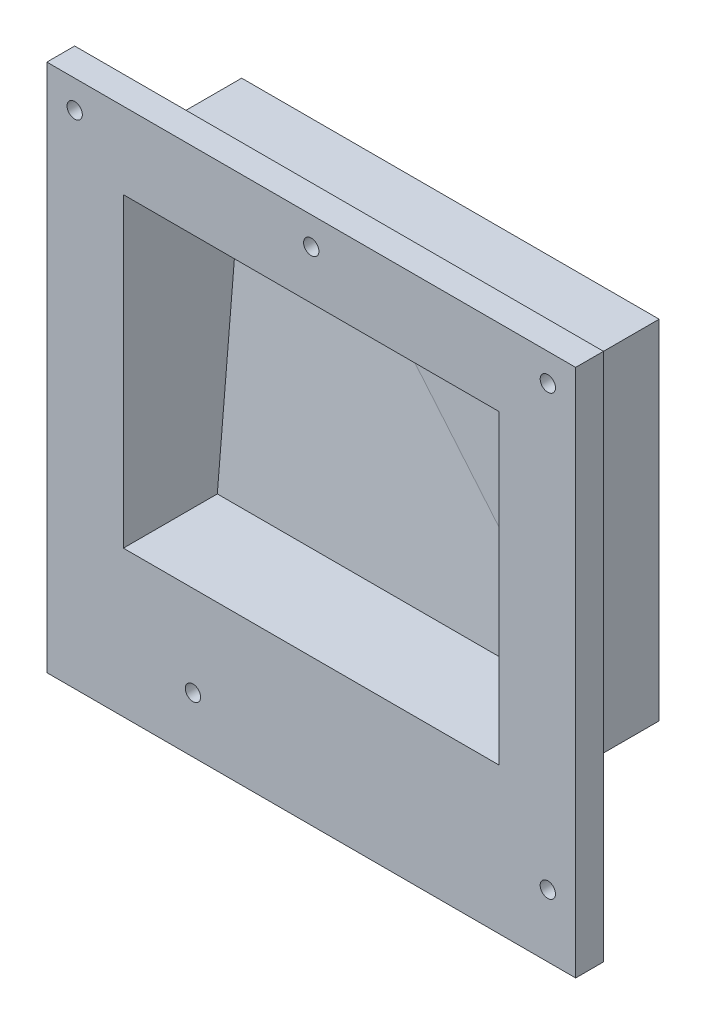
ISO-10303-21;
HEADER;
FILE_DESCRIPTION(('STEP AP214'),'2;1');
FILE_NAME('part.step','',(''),(''),'','','');
FILE_SCHEMA(('AUTOMOTIVE_DESIGN { 1 0 10303 214 1 1 1 1 }'));
ENDSEC;
DATA;
#1=APPLICATION_CONTEXT('core data for automotive mechanical design processes');
#2=APPLICATION_PROTOCOL_DEFINITION('international standard','automotive_design',2000,#1);
#3=PRODUCT_CONTEXT('',#1,'mechanical');
#4=PRODUCT('Part','Part','',(#3));
#5=PRODUCT_RELATED_PRODUCT_CATEGORY('part','',(#4));
#6=PRODUCT_DEFINITION_FORMATION('','',#4);
#7=PRODUCT_DEFINITION_CONTEXT('part definition',#1,'design');
#8=PRODUCT_DEFINITION('design','',#6,#7);
#9=PRODUCT_DEFINITION_SHAPE('','',#8);
#10=(LENGTH_UNIT() NAMED_UNIT(*) SI_UNIT(.MILLI.,.METRE.));
#11=(NAMED_UNIT(*) PLANE_ANGLE_UNIT() SI_UNIT($,.RADIAN.));
#12=(NAMED_UNIT(*) SI_UNIT($,.STERADIAN.) SOLID_ANGLE_UNIT());
#13=UNCERTAINTY_MEASURE_WITH_UNIT(LENGTH_MEASURE(1.E-05),#10,'distance_accuracy_value','');
#14=(GEOMETRIC_REPRESENTATION_CONTEXT(3) GLOBAL_UNCERTAINTY_ASSIGNED_CONTEXT((#13)) GLOBAL_UNIT_ASSIGNED_CONTEXT((#10,
#11,#12)) REPRESENTATION_CONTEXT('',''));
#15=CARTESIAN_POINT('',(0.,0.,0.));
#16=DIRECTION('',(0.,0.,1.));
#17=DIRECTION('',(1.,0.,0.));
#18=AXIS2_PLACEMENT_3D('',#15,#16,#17);
#19=CARTESIAN_POINT('',(60.,162.5,-40.));
#20=DIRECTION('',(-1.,0.,0.));
#21=DIRECTION('',(0.,0.,1.));
#22=AXIS2_PLACEMENT_3D('',#19,#20,#21);
#23=PLANE('',#22);
#24=DIRECTION('',(0.,0.,1.));
#25=VECTOR('',#24,1.);
#26=CARTESIAN_POINT('',(60.,52.5,-40.));
#27=LINE('',#26,#25);
#28=CARTESIAN_POINT('',(60.,52.5,-23.7511336474076));
#29=VERTEX_POINT('',#28);
#30=CARTESIAN_POINT('',(60.,52.5,10.));
#31=VERTEX_POINT('',#30);
#32=EDGE_CURVE('E159',#29,#31,#27,.T.);
#33=ORIENTED_EDGE('',*,*,#32,.F.);
#34=DIRECTION('',(0.,-0.996194698091745,0.0871557427476618));
#35=VECTOR('',#34,1.);
#36=CARTESIAN_POINT('',(60.,52.5,-23.7511336474076));
#37=LINE('',#36,#35);
#38=CARTESIAN_POINT('',(60.,152.499999999996,-32.5));
#39=VERTEX_POINT('',#38);
#40=EDGE_CURVE('E291',#29,#39,#37,.F.);
#41=ORIENTED_EDGE('',*,*,#40,.T.);
#42=DIRECTION('',(0.,1.,0.));
#43=VECTOR('',#42,1.);
#44=CARTESIAN_POINT('',(60.,-82.7081728298996,-32.5));
#45=LINE('',#44,#43);
#46=CARTESIAN_POINT('',(60.,162.5,-32.5));
#47=VERTEX_POINT('',#46);
#48=EDGE_CURVE('E303',#39,#47,#45,.T.);
#49=ORIENTED_EDGE('',*,*,#48,.T.);
#50=DIRECTION('',(0.,0.,1.));
#51=VECTOR('',#50,1.);
#52=CARTESIAN_POINT('',(60.,162.5,-40.));
#53=LINE('',#52,#51);
#54=CARTESIAN_POINT('',(60.,162.5,10.));
#55=VERTEX_POINT('',#54);
#56=EDGE_CURVE('E177',#47,#55,#53,.T.);
#57=ORIENTED_EDGE('',*,*,#56,.T.);
#58=DIRECTION('',(0.,-1.,0.));
#59=VECTOR('',#58,1.);
#60=CARTESIAN_POINT('',(60.,162.5,10.));
#61=LINE('',#60,#59);
#62=EDGE_CURVE('E168',#55,#31,#61,.T.);
#63=ORIENTED_EDGE('',*,*,#62,.T.);
#64=EDGE_LOOP('',(#33,#41,#49,#57,#63));
#65=FACE_BOUND('',#64,.T.);
#66=ADVANCED_FACE('F36',(#65),#23,.F.);
#67=CARTESIAN_POINT('',(60.,162.5,-40.));
#68=DIRECTION('',(0.,1.,0.));
#69=DIRECTION('',(0.,0.,1.));
#70=AXIS2_PLACEMENT_3D('',#67,#68,#69);
#71=PLANE('',#70);
#72=DIRECTION('',(-1.,0.,0.));
#73=VECTOR('',#72,1.);
#74=CARTESIAN_POINT('',(60.,162.5,-32.5));
#75=LINE('',#74,#73);
#76=CARTESIAN_POINT('',(95.0000000000039,162.5,-32.5));
#77=VERTEX_POINT('',#76);
#78=EDGE_CURVE('E297',#77,#47,#75,.T.);
#79=ORIENTED_EDGE('',*,*,#78,.F.);
#80=DIRECTION('',(-0.996194698091745,0.,-0.0871557427476618));
#81=VECTOR('',#80,1.);
#82=CARTESIAN_POINT('',(95.0000000000039,162.5,-32.5));
#83=LINE('',#82,#81);
#84=CARTESIAN_POINT('',(195.,162.5,-23.7511336474076));
#85=VERTEX_POINT('',#84);
#86=EDGE_CURVE('E46',#77,#85,#83,.F.);
#87=ORIENTED_EDGE('',*,*,#86,.T.);
#88=DIRECTION('',(0.,0.,1.));
#89=VECTOR('',#88,1.);
#90=CARTESIAN_POINT('',(195.,162.5,-40.));
#91=LINE('',#90,#89);
#92=CARTESIAN_POINT('',(195.,162.5,10.));
#93=VERTEX_POINT('',#92);
#94=EDGE_CURVE('E158',#85,#93,#91,.T.);
#95=ORIENTED_EDGE('',*,*,#94,.T.);
#96=DIRECTION('',(-1.,0.,0.));
#97=VECTOR('',#96,1.);
#98=CARTESIAN_POINT('',(60.,162.5,10.));
#99=LINE('',#98,#97);
#100=EDGE_CURVE('E172',#93,#55,#99,.T.);
#101=ORIENTED_EDGE('',*,*,#100,.T.);
#102=ORIENTED_EDGE('',*,*,#56,.F.);
#103=EDGE_LOOP('',(#79,#87,#95,#101,#102));
#104=FACE_BOUND('',#103,.T.);
#105=ADVANCED_FACE('F302',(#104),#71,.F.);
#106=CARTESIAN_POINT('',(195.,162.5,-40.));
#107=DIRECTION('',(1.,0.,0.));
#108=DIRECTION('',(0.,0.,-1.));
#109=AXIS2_PLACEMENT_3D('',#106,#107,#108);
#110=PLANE('',#109);
#111=ORIENTED_EDGE('',*,*,#94,.F.);
#112=DIRECTION('',(0.,-1.,0.));
#113=VECTOR('',#112,1.);
#114=CARTESIAN_POINT('',(195.,52.5,-23.7511336474076));
#115=LINE('',#114,#113);
#116=CARTESIAN_POINT('',(195.,52.5,-23.7511336474076));
#117=VERTEX_POINT('',#116);
#118=EDGE_CURVE('E11',#85,#117,#115,.T.);
#119=ORIENTED_EDGE('',*,*,#118,.T.);
#120=DIRECTION('',(0.,0.,1.));
#121=VECTOR('',#120,1.);
#122=CARTESIAN_POINT('',(195.,52.5,-40.));
#123=LINE('',#122,#121);
#124=CARTESIAN_POINT('',(195.,52.5,10.));
#125=VERTEX_POINT('',#124);
#126=EDGE_CURVE('E148',#117,#125,#123,.T.);
#127=ORIENTED_EDGE('',*,*,#126,.T.);
#128=DIRECTION('',(0.,1.,0.));
#129=VECTOR('',#128,1.);
#130=CARTESIAN_POINT('',(195.,162.5,10.));
#131=LINE('',#130,#129);
#132=EDGE_CURVE('E152',#125,#93,#131,.T.);
#133=ORIENTED_EDGE('',*,*,#132,.T.);
#134=EDGE_LOOP('',(#111,#119,#127,#133));
#135=FACE_BOUND('',#134,.T.);
#136=ADVANCED_FACE('F150',(#135),#110,.F.);
#137=CARTESIAN_POINT('',(60.,52.5,-40.));
#138=DIRECTION('',(0.,-1.,0.));
#139=DIRECTION('',(1.,0.,0.));
#140=AXIS2_PLACEMENT_3D('',#137,#138,#139);
#141=PLANE('',#140);
#142=ORIENTED_EDGE('',*,*,#126,.F.);
#143=DIRECTION('',(-1.,0.,0.));
#144=VECTOR('',#143,1.);
#145=CARTESIAN_POINT('',(60.,52.5,-23.7511336474076));
#146=LINE('',#145,#144);
#147=EDGE_CURVE('E289',#117,#29,#146,.T.);
#148=ORIENTED_EDGE('',*,*,#147,.T.);
#149=ORIENTED_EDGE('',*,*,#32,.T.);
#150=DIRECTION('',(1.,0.,0.));
#151=VECTOR('',#150,1.);
#152=CARTESIAN_POINT('',(60.,52.5,10.));
#153=LINE('',#152,#151);
#154=EDGE_CURVE('E162',#31,#125,#153,.T.);
#155=ORIENTED_EDGE('',*,*,#154,.T.);
#156=EDGE_LOOP('',(#142,#148,#149,#155));
#157=FACE_BOUND('',#156,.T.);
#158=ADVANCED_FACE('F163',(#157),#141,.F.);
#159=CARTESIAN_POINT('',(0.,0.,0.));
#160=DIRECTION('',(0.,0.,1.));
#161=DIRECTION('',(1.,0.,0.));
#162=AXIS2_PLACEMENT_3D('',#159,#160,#161);
#163=PLANE('',#162);
#164=CARTESIAN_POINT('',(212.5,22.5,0.));
#165=DIRECTION('',(0.,0.,1.));
#166=DIRECTION('',(1.,0.,0.));
#167=AXIS2_PLACEMENT_3D('',#164,#165,#166);
#168=CIRCLE('',#167,2.75000000000001);
#169=CARTESIAN_POINT('',(215.25,22.5,0.));
#170=VERTEX_POINT('',#169);
#171=EDGE_CURVE('E207',#170,#170,#168,.T.);
#172=ORIENTED_EDGE('',*,*,#171,.T.);
#173=EDGE_LOOP('',(#172));
#174=FACE_BOUND('',#173,.T.);
#175=CARTESIAN_POINT('',(42.5,180.,0.));
#176=DIRECTION('',(0.,0.,1.));
#177=DIRECTION('',(1.,0.,0.));
#178=AXIS2_PLACEMENT_3D('',#175,#176,#177);
#179=CIRCLE('',#178,2.75);
#180=CARTESIAN_POINT('',(45.25,180.,0.));
#181=VERTEX_POINT('',#180);
#182=EDGE_CURVE('E225',#181,#181,#179,.T.);
#183=ORIENTED_EDGE('',*,*,#182,.T.);
#184=EDGE_LOOP('',(#183));
#185=FACE_BOUND('',#184,.T.);
#186=CARTESIAN_POINT('',(127.5,180.,0.));
#187=DIRECTION('',(0.,0.,1.));
#188=DIRECTION('',(1.,0.,0.));
#189=AXIS2_PLACEMENT_3D('',#186,#187,#188);
#190=CIRCLE('',#189,2.75000000000001);
#191=CARTESIAN_POINT('',(130.25,180.,0.));
#192=VERTEX_POINT('',#191);
#193=EDGE_CURVE('E222',#192,#192,#190,.T.);
#194=ORIENTED_EDGE('',*,*,#193,.T.);
#195=EDGE_LOOP('',(#194));
#196=FACE_BOUND('',#195,.T.);
#197=CARTESIAN_POINT('',(212.5,180.,0.));
#198=DIRECTION('',(0.,0.,1.));
#199=DIRECTION('',(1.,0.,0.));
#200=AXIS2_PLACEMENT_3D('',#197,#198,#199);
#201=CIRCLE('',#200,2.75000000000001);
#202=CARTESIAN_POINT('',(215.25,180.,0.));
#203=VERTEX_POINT('',#202);
#204=EDGE_CURVE('E214',#203,#203,#201,.T.);
#205=ORIENTED_EDGE('',*,*,#204,.T.);
#206=EDGE_LOOP('',(#205));
#207=FACE_BOUND('',#206,.T.);
#208=DIRECTION('',(0.,1.,0.));
#209=VECTOR('',#208,1.);
#210=CARTESIAN_POINT('',(52.5,0.,0.));
#211=LINE('',#210,#209);
#212=CARTESIAN_POINT('',(52.5,0.,0.));
#213=VERTEX_POINT('',#212);
#214=CARTESIAN_POINT('',(52.5,170.,0.));
#215=VERTEX_POINT('',#214);
#216=EDGE_CURVE('E278',#213,#215,#211,.T.);
#217=ORIENTED_EDGE('',*,*,#216,.F.);
#218=DIRECTION('',(1.,0.,0.));
#219=VECTOR('',#218,1.);
#220=CARTESIAN_POINT('',(0.,0.,0.));
#221=LINE('',#220,#219);
#222=CARTESIAN_POINT('',(32.5,0.,0.));
#223=VERTEX_POINT('',#222);
#224=EDGE_CURVE('E267',#223,#213,#221,.T.);
#225=ORIENTED_EDGE('',*,*,#224,.F.);
#226=DIRECTION('',(0.,1.,0.));
#227=VECTOR('',#226,1.);
#228=CARTESIAN_POINT('',(32.5,0.,0.));
#229=LINE('',#228,#227);
#230=CARTESIAN_POINT('',(32.5,190.,0.));
#231=VERTEX_POINT('',#230);
#232=EDGE_CURVE('E250',#223,#231,#229,.T.);
#233=ORIENTED_EDGE('',*,*,#232,.T.);
#234=DIRECTION('',(1.,0.,0.));
#235=VECTOR('',#234,1.);
#236=CARTESIAN_POINT('',(0.,190.,0.));
#237=LINE('',#236,#235);
#238=CARTESIAN_POINT('',(222.5,190.,0.));
#239=VERTEX_POINT('',#238);
#240=EDGE_CURVE('E273',#231,#239,#237,.T.);
#241=ORIENTED_EDGE('',*,*,#240,.T.);
#242=DIRECTION('',(0.,-1.,0.));
#243=VECTOR('',#242,1.);
#244=CARTESIAN_POINT('',(222.5,0.,0.));
#245=LINE('',#244,#243);
#246=CARTESIAN_POINT('',(222.5,0.,0.));
#247=VERTEX_POINT('',#246);
#248=EDGE_CURVE('E270',#239,#247,#245,.T.);
#249=ORIENTED_EDGE('',*,*,#248,.T.);
#250=CARTESIAN_POINT('',(202.5,0.,0.));
#251=VERTEX_POINT('',#250);
#252=EDGE_CURVE('E266',#251,#247,#221,.T.);
#253=ORIENTED_EDGE('',*,*,#252,.F.);
#254=DIRECTION('',(0.,-1.,0.));
#255=VECTOR('',#254,1.);
#256=CARTESIAN_POINT('',(202.5,0.,0.));
#257=LINE('',#256,#255);
#258=CARTESIAN_POINT('',(202.5,170.,0.));
#259=VERTEX_POINT('',#258);
#260=EDGE_CURVE('E276',#259,#251,#257,.T.);
#261=ORIENTED_EDGE('',*,*,#260,.F.);
#262=DIRECTION('',(1.,0.,0.));
#263=VECTOR('',#262,1.);
#264=CARTESIAN_POINT('',(0.,170.,0.));
#265=LINE('',#264,#263);
#266=EDGE_CURVE('E255',#215,#259,#265,.T.);
#267=ORIENTED_EDGE('',*,*,#266,.F.);
#268=EDGE_LOOP('',(#217,#225,#233,#241,#249,#253,#261,#267));
#269=FACE_BOUND('',#268,.T.);
#270=ADVANCED_FACE('F367',(#174,#185,#196,#207,#269),#163,.F.);
#271=CARTESIAN_POINT('',(32.5,0.,10.));
#272=DIRECTION('',(-1.,0.,0.));
#273=DIRECTION('',(0.,-1.,0.));
#274=AXIS2_PLACEMENT_3D('',#271,#272,#273);
#275=PLANE('',#274);
#276=ORIENTED_EDGE('',*,*,#232,.F.);
#277=DIRECTION('',(0.,0.,-1.));
#278=VECTOR('',#277,1.);
#279=CARTESIAN_POINT('',(32.5,0.,10.));
#280=LINE('',#279,#278);
#281=CARTESIAN_POINT('',(32.5,0.,10.));
#282=VERTEX_POINT('',#281);
#283=EDGE_CURVE('E287',#282,#223,#280,.T.);
#284=ORIENTED_EDGE('',*,*,#283,.F.);
#285=DIRECTION('',(0.,1.,0.));
#286=VECTOR('',#285,1.);
#287=CARTESIAN_POINT('',(32.5,0.,10.));
#288=LINE('',#287,#286);
#289=CARTESIAN_POINT('',(32.5,190.,10.));
#290=VERTEX_POINT('',#289);
#291=EDGE_CURVE('E251',#282,#290,#288,.T.);
#292=ORIENTED_EDGE('',*,*,#291,.T.);
#293=DIRECTION('',(0.,0.,-1.));
#294=VECTOR('',#293,1.);
#295=CARTESIAN_POINT('',(32.5,190.,10.));
#296=LINE('',#295,#294);
#297=EDGE_CURVE('E263',#290,#231,#296,.T.);
#298=ORIENTED_EDGE('',*,*,#297,.T.);
#299=EDGE_LOOP('',(#276,#284,#292,#298));
#300=FACE_BOUND('',#299,.T.);
#301=ADVANCED_FACE('F370',(#300),#275,.T.);
#302=CARTESIAN_POINT('',(0.,0.,10.));
#303=DIRECTION('',(0.,1.,0.));
#304=DIRECTION('',(0.,0.,1.));
#305=AXIS2_PLACEMENT_3D('',#302,#303,#304);
#306=PLANE('',#305);
#307=ORIENTED_EDGE('',*,*,#224,.T.);
#308=DIRECTION('',(0.,0.,1.));
#309=VECTOR('',#308,1.);
#310=CARTESIAN_POINT('',(52.5,0.,-10.));
#311=LINE('',#310,#309);
#312=CARTESIAN_POINT('',(52.5,0.,-10.));
#313=VERTEX_POINT('',#312);
#314=EDGE_CURVE('E244',#313,#213,#311,.T.);
#315=ORIENTED_EDGE('',*,*,#314,.F.);
#316=DIRECTION('',(-1.,0.,0.));
#317=VECTOR('',#316,1.);
#318=CARTESIAN_POINT('',(52.5,0.,-10.));
#319=LINE('',#318,#317);
#320=CARTESIAN_POINT('',(202.5,0.,-10.));
#321=VERTEX_POINT('',#320);
#322=EDGE_CURVE('E242',#321,#313,#319,.T.);
#323=ORIENTED_EDGE('',*,*,#322,.F.);
#324=DIRECTION('',(0.,0.,1.));
#325=VECTOR('',#324,1.);
#326=CARTESIAN_POINT('',(202.5,0.,-10.));
#327=LINE('',#326,#325);
#328=EDGE_CURVE('E247',#321,#251,#327,.T.);
#329=ORIENTED_EDGE('',*,*,#328,.T.);
#330=ORIENTED_EDGE('',*,*,#252,.T.);
#331=DIRECTION('',(0.,0.,-1.));
#332=VECTOR('',#331,1.);
#333=CARTESIAN_POINT('',(222.5,0.,10.));
#334=LINE('',#333,#332);
#335=CARTESIAN_POINT('',(222.5,0.,10.));
#336=VERTEX_POINT('',#335);
#337=EDGE_CURVE('E284',#336,#247,#334,.T.);
#338=ORIENTED_EDGE('',*,*,#337,.F.);
#339=DIRECTION('',(1.,0.,0.));
#340=VECTOR('',#339,1.);
#341=CARTESIAN_POINT('',(0.,0.,10.));
#342=LINE('',#341,#340);
#343=EDGE_CURVE('E254',#282,#336,#342,.T.);
#344=ORIENTED_EDGE('',*,*,#343,.F.);
#345=ORIENTED_EDGE('',*,*,#283,.T.);
#346=EDGE_LOOP('',(#307,#315,#323,#329,#330,#338,#344,#345));
#347=FACE_BOUND('',#346,.T.);
#348=ADVANCED_FACE('F378',(#347),#306,.F.);
#349=CARTESIAN_POINT('',(222.5,0.,10.));
#350=DIRECTION('',(1.,0.,0.));
#351=DIRECTION('',(0.,0.,-1.));
#352=AXIS2_PLACEMENT_3D('',#349,#350,#351);
#353=PLANE('',#352);
#354=ORIENTED_EDGE('',*,*,#248,.F.);
#355=DIRECTION('',(0.,0.,-1.));
#356=VECTOR('',#355,1.);
#357=CARTESIAN_POINT('',(222.5,190.,10.));
#358=LINE('',#357,#356);
#359=CARTESIAN_POINT('',(222.5,190.,10.));
#360=VERTEX_POINT('',#359);
#361=EDGE_CURVE('E282',#360,#239,#358,.T.);
#362=ORIENTED_EDGE('',*,*,#361,.F.);
#363=DIRECTION('',(0.,-1.,0.));
#364=VECTOR('',#363,1.);
#365=CARTESIAN_POINT('',(222.5,0.,10.));
#366=LINE('',#365,#364);
#367=EDGE_CURVE('E257',#360,#336,#366,.T.);
#368=ORIENTED_EDGE('',*,*,#367,.T.);
#369=ORIENTED_EDGE('',*,*,#337,.T.);
#370=EDGE_LOOP('',(#354,#362,#368,#369));
#371=FACE_BOUND('',#370,.T.);
#372=ADVANCED_FACE('F374',(#371),#353,.T.);
#373=CARTESIAN_POINT('',(0.,190.,10.));
#374=DIRECTION('',(0.,1.,0.));
#375=DIRECTION('',(0.,0.,1.));
#376=AXIS2_PLACEMENT_3D('',#373,#374,#375);
#377=PLANE('',#376);
#378=ORIENTED_EDGE('',*,*,#240,.F.);
#379=ORIENTED_EDGE('',*,*,#297,.F.);
#380=DIRECTION('',(1.,0.,0.));
#381=VECTOR('',#380,1.);
#382=CARTESIAN_POINT('',(0.,190.,10.));
#383=LINE('',#382,#381);
#384=EDGE_CURVE('E260',#290,#360,#383,.T.);
#385=ORIENTED_EDGE('',*,*,#384,.T.);
#386=ORIENTED_EDGE('',*,*,#361,.T.);
#387=EDGE_LOOP('',(#378,#379,#385,#386));
#388=FACE_BOUND('',#387,.T.);
#389=ADVANCED_FACE('F365',(#388),#377,.T.);
#390=CARTESIAN_POINT('',(0.,0.,10.));
#391=DIRECTION('',(0.,0.,1.));
#392=DIRECTION('',(1.,0.,0.));
#393=AXIS2_PLACEMENT_3D('',#390,#391,#392);
#394=PLANE('',#393);
#395=CARTESIAN_POINT('',(212.5,22.5,10.));
#396=DIRECTION('',(0.,0.,1.));
#397=DIRECTION('',(1.,0.,0.));
#398=AXIS2_PLACEMENT_3D('',#395,#396,#397);
#399=CIRCLE('',#398,2.75000000000001);
#400=CARTESIAN_POINT('',(215.25,22.5,10.));
#401=VERTEX_POINT('',#400);
#402=EDGE_CURVE('E197',#401,#401,#399,.T.);
#403=ORIENTED_EDGE('',*,*,#402,.F.);
#404=EDGE_LOOP('',(#403));
#405=FACE_BOUND('',#404,.T.);
#406=CARTESIAN_POINT('',(42.5,180.,10.));
#407=DIRECTION('',(0.,0.,1.));
#408=DIRECTION('',(1.,0.,0.));
#409=AXIS2_PLACEMENT_3D('',#406,#407,#408);
#410=CIRCLE('',#409,2.75);
#411=CARTESIAN_POINT('',(45.25,180.,10.));
#412=VERTEX_POINT('',#411);
#413=EDGE_CURVE('E211',#412,#412,#410,.T.);
#414=ORIENTED_EDGE('',*,*,#413,.F.);
#415=EDGE_LOOP('',(#414));
#416=FACE_BOUND('',#415,.T.);
#417=CARTESIAN_POINT('',(127.5,180.,10.));
#418=DIRECTION('',(0.,0.,1.));
#419=DIRECTION('',(1.,0.,0.));
#420=AXIS2_PLACEMENT_3D('',#417,#418,#419);
#421=CIRCLE('',#420,2.75000000000001);
#422=CARTESIAN_POINT('',(130.25,180.,10.));
#423=VERTEX_POINT('',#422);
#424=EDGE_CURVE('E215',#423,#423,#421,.T.);
#425=ORIENTED_EDGE('',*,*,#424,.F.);
#426=EDGE_LOOP('',(#425));
#427=FACE_BOUND('',#426,.T.);
#428=CARTESIAN_POINT('',(212.5,180.,10.));
#429=DIRECTION('',(0.,0.,1.));
#430=DIRECTION('',(1.,0.,0.));
#431=AXIS2_PLACEMENT_3D('',#428,#429,#430);
#432=CIRCLE('',#431,2.75000000000001);
#433=CARTESIAN_POINT('',(215.25,180.,10.));
#434=VERTEX_POINT('',#433);
#435=EDGE_CURVE('E210',#434,#434,#432,.T.);
#436=ORIENTED_EDGE('',*,*,#435,.F.);
#437=EDGE_LOOP('',(#436));
#438=FACE_BOUND('',#437,.T.);
#439=CARTESIAN_POINT('',(85.,20.,10.));
#440=DIRECTION('',(0.,0.,1.));
#441=DIRECTION('',(1.,0.,0.));
#442=AXIS2_PLACEMENT_3D('',#439,#440,#441);
#443=CIRCLE('',#442,2.75000000000001);
#444=CARTESIAN_POINT('',(87.75,20.,10.));
#445=VERTEX_POINT('',#444);
#446=EDGE_CURVE('E231',#445,#445,#443,.T.);
#447=ORIENTED_EDGE('',*,*,#446,.F.);
#448=EDGE_LOOP('',(#447));
#449=FACE_BOUND('',#448,.T.);
#450=ORIENTED_EDGE('',*,*,#291,.F.);
#451=ORIENTED_EDGE('',*,*,#343,.T.);
#452=ORIENTED_EDGE('',*,*,#367,.F.);
#453=ORIENTED_EDGE('',*,*,#384,.F.);
#454=EDGE_LOOP('',(#450,#451,#452,#453));
#455=FACE_BOUND('',#454,.T.);
#456=ORIENTED_EDGE('',*,*,#62,.F.);
#457=ORIENTED_EDGE('',*,*,#100,.F.);
#458=ORIENTED_EDGE('',*,*,#132,.F.);
#459=ORIENTED_EDGE('',*,*,#154,.F.);
#460=EDGE_LOOP('',(#456,#457,#458,#459));
#461=FACE_BOUND('',#460,.T.);
#462=ADVANCED_FACE('F170',(#405,#416,#427,#438,#449,#455,#461),#394,.T.);
#463=CARTESIAN_POINT('',(52.5,45.,-10.));
#464=DIRECTION('',(1.,0.,0.));
#465=DIRECTION('',(0.,0.,-1.));
#466=AXIS2_PLACEMENT_3D('',#463,#464,#465);
#467=PLANE('',#466);
#468=ORIENTED_EDGE('',*,*,#314,.T.);
#469=ORIENTED_EDGE('',*,*,#216,.T.);
#470=DIRECTION('',(0.,0.,1.));
#471=VECTOR('',#470,1.);
#472=CARTESIAN_POINT('',(52.5,170.,-40.));
#473=LINE('',#472,#471);
#474=CARTESIAN_POINT('',(52.5,170.,-40.));
#475=VERTEX_POINT('',#474);
#476=EDGE_CURVE('E194',#475,#215,#473,.T.);
#477=ORIENTED_EDGE('',*,*,#476,.F.);
#478=DIRECTION('',(0.,-1.,0.));
#479=VECTOR('',#478,1.);
#480=CARTESIAN_POINT('',(52.5,170.,-40.));
#481=LINE('',#480,#479);
#482=CARTESIAN_POINT('',(52.5,45.,-40.));
#483=VERTEX_POINT('',#482);
#484=EDGE_CURVE('E179',#475,#483,#481,.T.);
#485=ORIENTED_EDGE('',*,*,#484,.T.);
#486=DIRECTION('',(0.,0.,1.));
#487=VECTOR('',#486,1.);
#488=CARTESIAN_POINT('',(52.5,45.,-40.));
#489=LINE('',#488,#487);
#490=CARTESIAN_POINT('',(52.5,45.,-10.));
#491=VERTEX_POINT('',#490);
#492=EDGE_CURVE('E193',#483,#491,#489,.T.);
#493=ORIENTED_EDGE('',*,*,#492,.T.);
#494=DIRECTION('',(0.,1.,0.));
#495=VECTOR('',#494,1.);
#496=CARTESIAN_POINT('',(52.5,45.,-10.));
#497=LINE('',#496,#495);
#498=EDGE_CURVE('E234',#313,#491,#497,.T.);
#499=ORIENTED_EDGE('',*,*,#498,.F.);
#500=EDGE_LOOP('',(#468,#469,#477,#485,#493,#499));
#501=FACE_BOUND('',#500,.T.);
#502=ADVANCED_FACE('F358',(#501),#467,.F.);
#503=CARTESIAN_POINT('',(202.5,45.,-10.));
#504=DIRECTION('',(-1.,0.,0.));
#505=DIRECTION('',(0.,0.,1.));
#506=AXIS2_PLACEMENT_3D('',#503,#504,#505);
#507=PLANE('',#506);
#508=ORIENTED_EDGE('',*,*,#260,.T.);
#509=ORIENTED_EDGE('',*,*,#328,.F.);
#510=DIRECTION('',(0.,-1.,0.));
#511=VECTOR('',#510,1.);
#512=CARTESIAN_POINT('',(202.5,45.,-10.));
#513=LINE('',#512,#511);
#514=CARTESIAN_POINT('',(202.5,45.,-10.));
#515=VERTEX_POINT('',#514);
#516=EDGE_CURVE('E240',#515,#321,#513,.T.);
#517=ORIENTED_EDGE('',*,*,#516,.F.);
#518=DIRECTION('',(0.,0.,1.));
#519=VECTOR('',#518,1.);
#520=CARTESIAN_POINT('',(202.5,45.,-40.));
#521=LINE('',#520,#519);
#522=CARTESIAN_POINT('',(202.5,45.,-40.));
#523=VERTEX_POINT('',#522);
#524=EDGE_CURVE('E201',#523,#515,#521,.T.);
#525=ORIENTED_EDGE('',*,*,#524,.F.);
#526=DIRECTION('',(0.,1.,0.));
#527=VECTOR('',#526,1.);
#528=CARTESIAN_POINT('',(202.5,170.,-40.));
#529=LINE('',#528,#527);
#530=CARTESIAN_POINT('',(202.5,170.,-40.));
#531=VERTEX_POINT('',#530);
#532=EDGE_CURVE('E187',#523,#531,#529,.T.);
#533=ORIENTED_EDGE('',*,*,#532,.T.);
#534=DIRECTION('',(0.,0.,1.));
#535=VECTOR('',#534,1.);
#536=CARTESIAN_POINT('',(202.5,170.,-40.));
#537=LINE('',#536,#535);
#538=EDGE_CURVE('E198',#531,#259,#537,.T.);
#539=ORIENTED_EDGE('',*,*,#538,.T.);
#540=EDGE_LOOP('',(#508,#509,#517,#525,#533,#539));
#541=FACE_BOUND('',#540,.T.);
#542=ADVANCED_FACE('F354',(#541),#507,.F.);
#543=CARTESIAN_POINT('',(0.,0.,-10.));
#544=DIRECTION('',(0.,0.,1.));
#545=DIRECTION('',(1.,0.,0.));
#546=AXIS2_PLACEMENT_3D('',#543,#544,#545);
#547=PLANE('',#546);
#548=CARTESIAN_POINT('',(85.,20.,-10.));
#549=DIRECTION('',(0.,0.,-1.));
#550=DIRECTION('',(-1.,0.,0.));
#551=AXIS2_PLACEMENT_3D('',#548,#549,#550);
#552=CIRCLE('',#551,2.75000000000001);
#553=CARTESIAN_POINT('',(82.25,20.,-10.));
#554=VERTEX_POINT('',#553);
#555=EDGE_CURVE('E228',#554,#554,#552,.T.);
#556=ORIENTED_EDGE('',*,*,#555,.F.);
#557=EDGE_LOOP('',(#556));
#558=FACE_BOUND('',#557,.T.);
#559=ORIENTED_EDGE('',*,*,#498,.T.);
#560=DIRECTION('',(1.,0.,0.));
#561=VECTOR('',#560,1.);
#562=CARTESIAN_POINT('',(52.5,45.,-10.));
#563=LINE('',#562,#561);
#564=EDGE_CURVE('E237',#491,#515,#563,.T.);
#565=ORIENTED_EDGE('',*,*,#564,.T.);
#566=ORIENTED_EDGE('',*,*,#516,.T.);
#567=ORIENTED_EDGE('',*,*,#322,.T.);
#568=EDGE_LOOP('',(#559,#565,#566,#567));
#569=FACE_BOUND('',#568,.T.);
#570=ADVANCED_FACE('F350',(#558,#569),#547,.F.);
#571=CARTESIAN_POINT('',(85.,20.,20.));
#572=DIRECTION('',(0.,0.,-1.));
#573=DIRECTION('',(-1.,0.,0.));
#574=AXIS2_PLACEMENT_3D('',#571,#572,#573);
#575=CYLINDRICAL_SURFACE('',#574,2.75000000000001);
#576=ORIENTED_EDGE('',*,*,#446,.T.);
#577=EDGE_LOOP('',(#576));
#578=FACE_BOUND('',#577,.T.);
#579=ORIENTED_EDGE('',*,*,#555,.T.);
#580=EDGE_LOOP('',(#579));
#581=FACE_BOUND('',#580,.T.);
#582=ADVANCED_FACE('F346',(#578,#581),#575,.F.);
#583=CARTESIAN_POINT('',(212.5,180.,-20.));
#584=DIRECTION('',(0.,0.,1.));
#585=DIRECTION('',(1.,0.,0.));
#586=AXIS2_PLACEMENT_3D('',#583,#584,#585);
#587=CYLINDRICAL_SURFACE('',#586,2.75000000000001);
#588=ORIENTED_EDGE('',*,*,#435,.T.);
#589=EDGE_LOOP('',(#588));
#590=FACE_BOUND('',#589,.T.);
#591=ORIENTED_EDGE('',*,*,#204,.F.);
#592=EDGE_LOOP('',(#591));
#593=FACE_BOUND('',#592,.T.);
#594=ADVANCED_FACE('F342',(#590,#593),#587,.F.);
#595=CARTESIAN_POINT('',(127.5,180.,-20.));
#596=DIRECTION('',(0.,0.,1.));
#597=DIRECTION('',(1.,0.,0.));
#598=AXIS2_PLACEMENT_3D('',#595,#596,#597);
#599=CYLINDRICAL_SURFACE('',#598,2.75000000000001);
#600=ORIENTED_EDGE('',*,*,#424,.T.);
#601=EDGE_LOOP('',(#600));
#602=FACE_BOUND('',#601,.T.);
#603=ORIENTED_EDGE('',*,*,#193,.F.);
#604=EDGE_LOOP('',(#603));
#605=FACE_BOUND('',#604,.T.);
#606=ADVANCED_FACE('F338',(#602,#605),#599,.F.);
#607=CARTESIAN_POINT('',(42.5,180.,-20.));
#608=DIRECTION('',(0.,0.,1.));
#609=DIRECTION('',(1.,0.,0.));
#610=AXIS2_PLACEMENT_3D('',#607,#608,#609);
#611=CYLINDRICAL_SURFACE('',#610,2.75);
#612=ORIENTED_EDGE('',*,*,#413,.T.);
#613=EDGE_LOOP('',(#612));
#614=FACE_BOUND('',#613,.T.);
#615=ORIENTED_EDGE('',*,*,#182,.F.);
#616=EDGE_LOOP('',(#615));
#617=FACE_BOUND('',#616,.T.);
#618=ADVANCED_FACE('F334',(#614,#617),#611,.F.);
#619=CARTESIAN_POINT('',(212.5,22.5,-37.));
#620=DIRECTION('',(0.,0.,1.));
#621=DIRECTION('',(1.,0.,0.));
#622=AXIS2_PLACEMENT_3D('',#619,#620,#621);
#623=CYLINDRICAL_SURFACE('',#622,2.75000000000001);
#624=CARTESIAN_POINT('',(215.25,22.5,10.));
#625=CARTESIAN_POINT('',(215.25,22.5,9.89583333333333));
#626=CARTESIAN_POINT('',(215.25,22.5,9.79166666666667));
#627=CARTESIAN_POINT('',(215.25,22.5,9.58333333333333));
#628=CARTESIAN_POINT('',(215.25,22.5,9.47916666666667));
#629=CARTESIAN_POINT('',(215.25,22.5,9.27083333333333));
#630=CARTESIAN_POINT('',(215.25,22.5,9.16666666666667));
#631=CARTESIAN_POINT('',(215.25,22.5,8.95833333333333));
#632=CARTESIAN_POINT('',(215.25,22.5,8.85416666666667));
#633=CARTESIAN_POINT('',(215.25,22.5,8.64583333333333));
#634=CARTESIAN_POINT('',(215.25,22.5,8.54166666666667));
#635=CARTESIAN_POINT('',(215.25,22.5,8.33333333333333));
#636=CARTESIAN_POINT('',(215.25,22.5,8.22916666666667));
#637=CARTESIAN_POINT('',(215.25,22.5,8.02083333333333));
#638=CARTESIAN_POINT('',(215.25,22.5,7.91666666666667));
#639=CARTESIAN_POINT('',(215.25,22.5,7.70833333333333));
#640=CARTESIAN_POINT('',(215.25,22.5,7.60416666666667));
#641=CARTESIAN_POINT('',(215.25,22.5,7.39583333333333));
#642=CARTESIAN_POINT('',(215.25,22.5,7.29166666666667));
#643=CARTESIAN_POINT('',(215.25,22.5,7.08333333333333));
#644=CARTESIAN_POINT('',(215.25,22.5,6.97916666666667));
#645=CARTESIAN_POINT('',(215.25,22.5,6.77083333333333));
#646=CARTESIAN_POINT('',(215.25,22.5,6.66666666666667));
#647=CARTESIAN_POINT('',(215.25,22.5,6.45833333333333));
#648=CARTESIAN_POINT('',(215.25,22.5,6.35416666666667));
#649=CARTESIAN_POINT('',(215.25,22.5,6.14583333333333));
#650=CARTESIAN_POINT('',(215.25,22.5,6.04166666666667));
#651=CARTESIAN_POINT('',(215.25,22.5,5.83333333333333));
#652=CARTESIAN_POINT('',(215.25,22.5,5.72916666666666));
#653=CARTESIAN_POINT('',(215.25,22.5,5.52083333333333));
#654=CARTESIAN_POINT('',(215.25,22.5,5.41666666666666));
#655=CARTESIAN_POINT('',(215.25,22.5,5.20833333333333));
#656=CARTESIAN_POINT('',(215.25,22.5,5.10416666666666));
#657=CARTESIAN_POINT('',(215.25,22.5,4.89583333333333));
#658=CARTESIAN_POINT('',(215.25,22.5,4.79166666666666));
#659=CARTESIAN_POINT('',(215.25,22.5,4.58333333333333));
#660=CARTESIAN_POINT('',(215.25,22.5,4.47916666666666));
#661=CARTESIAN_POINT('',(215.25,22.5,4.27083333333333));
#662=CARTESIAN_POINT('',(215.25,22.5,4.16666666666666));
#663=CARTESIAN_POINT('',(215.25,22.5,3.95833333333333));
#664=CARTESIAN_POINT('',(215.25,22.5,3.85416666666666));
#665=CARTESIAN_POINT('',(215.25,22.5,3.64583333333333));
#666=CARTESIAN_POINT('',(215.25,22.5,3.54166666666666));
#667=CARTESIAN_POINT('',(215.25,22.5,3.33333333333333));
#668=CARTESIAN_POINT('',(215.25,22.5,3.22916666666666));
#669=CARTESIAN_POINT('',(215.25,22.5,3.02083333333333));
#670=CARTESIAN_POINT('',(215.25,22.5,2.91666666666666));
#671=CARTESIAN_POINT('',(215.25,22.5,2.70833333333333));
#672=CARTESIAN_POINT('',(215.25,22.5,2.60416666666666));
#673=CARTESIAN_POINT('',(215.25,22.5,2.39583333333333));
#674=CARTESIAN_POINT('',(215.25,22.5,2.29166666666666));
#675=CARTESIAN_POINT('',(215.25,22.5,2.08333333333333));
#676=CARTESIAN_POINT('',(215.25,22.5,1.97916666666666));
#677=CARTESIAN_POINT('',(215.25,22.5,1.77083333333333));
#678=CARTESIAN_POINT('',(215.25,22.5,1.66666666666666));
#679=CARTESIAN_POINT('',(215.25,22.5,1.45833333333333));
#680=CARTESIAN_POINT('',(215.25,22.5,1.35416666666666));
#681=CARTESIAN_POINT('',(215.25,22.5,1.14583333333333));
#682=CARTESIAN_POINT('',(215.25,22.5,1.04166666666666));
#683=CARTESIAN_POINT('',(215.25,22.5,0.833333333333327));
#684=CARTESIAN_POINT('',(215.25,22.5,0.72916666666666));
#685=CARTESIAN_POINT('',(215.25,22.5,0.520833333333327));
#686=CARTESIAN_POINT('',(215.25,22.5,0.41666666666666));
#687=CARTESIAN_POINT('',(215.25,22.5,0.208333333333327));
#688=CARTESIAN_POINT('',(215.25,22.5,0.10416666666666));
#689=CARTESIAN_POINT('',(215.25,22.5,0.));
#690=B_SPLINE_CURVE_WITH_KNOTS('',3,(#624,#625,#626,#627,#628,#629,#630,#631,#632,#633,#634,
#635,#636,#637,#638,#639,#640,#641,#642,#643,#644,#645,#646,#647,#648,#649,#650,#651,#652,#653,
#654,#655,#656,#657,#658,#659,#660,#661,#662,#663,#664,#665,#666,#667,#668,#669,#670,#671,#672,
#673,#674,#675,#676,#677,#678,#679,#680,#681,#682,#683,#684,#685,#686,#687,#688,#689),
.UNSPECIFIED.,.F.,.F.,(4,2,2,2,2,2,2,2,2,2,2,2,2,2,2,2,2,2,2,2,2,2,2,2,2,2,2,2,2,2,2,2,4),(0.,
0.3125,0.625000000000001,0.937500000000001,1.25,1.5625,1.875,2.1875,2.5,2.8125,3.125,3.4375,
3.75,4.0625,4.375,4.6875,5.,5.3125,5.62500000000001,5.93750000000001,6.25000000000001,
6.56250000000001,6.87500000000001,7.18750000000001,7.50000000000001,7.81250000000001,
8.12500000000001,8.43750000000001,8.75000000000001,9.06250000000001,9.37500000000001,
9.68750000000001,10.),.UNSPECIFIED.);
#691=EDGE_CURVE('BSEAM327',#401,#170,#690,.T.);
#692=ORIENTED_EDGE('',*,*,#402,.T.);
#693=ORIENTED_EDGE('',*,*,#171,.F.);
#694=ORIENTED_EDGE('',*,*,#691,.T.);
#695=ORIENTED_EDGE('',*,*,#691,.F.);
#696=EDGE_LOOP('',(#692,#694,#693,#695));
#697=FACE_BOUND('',#696,.T.);
#698=ADVANCED_FACE('F327',(#697),#623,.F.);
#699=CARTESIAN_POINT('',(52.5,170.,-40.));
#700=DIRECTION('',(0.,1.,0.));
#701=DIRECTION('',(0.,0.,1.));
#702=AXIS2_PLACEMENT_3D('',#699,#700,#701);
#703=PLANE('',#702);
#704=ORIENTED_EDGE('',*,*,#266,.T.);
#705=ORIENTED_EDGE('',*,*,#538,.F.);
#706=DIRECTION('',(-1.,0.,0.));
#707=VECTOR('',#706,1.);
#708=CARTESIAN_POINT('',(52.5,170.,-40.));
#709=LINE('',#708,#707);
#710=EDGE_CURVE('E190',#531,#475,#709,.T.);
#711=ORIENTED_EDGE('',*,*,#710,.T.);
#712=ORIENTED_EDGE('',*,*,#476,.T.);
#713=EDGE_LOOP('',(#704,#705,#711,#712));
#714=FACE_BOUND('',#713,.T.);
#715=ADVANCED_FACE('F324',(#714),#703,.T.);
#716=CARTESIAN_POINT('',(52.5,45.,-40.));
#717=DIRECTION('',(0.,-1.,0.));
#718=DIRECTION('',(0.,0.,-1.));
#719=AXIS2_PLACEMENT_3D('',#716,#717,#718);
#720=PLANE('',#719);
#721=ORIENTED_EDGE('',*,*,#564,.F.);
#722=ORIENTED_EDGE('',*,*,#492,.F.);
#723=DIRECTION('',(1.,0.,0.));
#724=VECTOR('',#723,1.);
#725=CARTESIAN_POINT('',(52.5,45.,-40.));
#726=LINE('',#725,#724);
#727=EDGE_CURVE('E184',#483,#523,#726,.T.);
#728=ORIENTED_EDGE('',*,*,#727,.T.);
#729=ORIENTED_EDGE('',*,*,#524,.T.);
#730=EDGE_LOOP('',(#721,#722,#728,#729));
#731=FACE_BOUND('',#730,.T.);
#732=ADVANCED_FACE('F322',(#731),#720,.T.);
#733=CARTESIAN_POINT('',(0.,0.,-40.));
#734=DIRECTION('',(0.,0.,1.));
#735=DIRECTION('',(1.,0.,0.));
#736=AXIS2_PLACEMENT_3D('',#733,#734,#735);
#737=PLANE('',#736);
#738=ORIENTED_EDGE('',*,*,#484,.F.);
#739=ORIENTED_EDGE('',*,*,#710,.F.);
#740=ORIENTED_EDGE('',*,*,#532,.F.);
#741=ORIENTED_EDGE('',*,*,#727,.F.);
#742=EDGE_LOOP('',(#738,#739,#740,#741));
#743=FACE_BOUND('',#742,.T.);
#744=ADVANCED_FACE('F319',(#743),#737,.F.);
#745=CARTESIAN_POINT('',(60.,-82.7081728298996,-32.5));
#746=DIRECTION('',(0.,0.,-1.));
#747=DIRECTION('',(-1.,0.,0.));
#748=AXIS2_PLACEMENT_3D('',#745,#746,#747);
#749=PLANE('',#748);
#750=ORIENTED_EDGE('',*,*,#48,.F.);
#751=DIRECTION('',(1.,0.,0.));
#752=VECTOR('',#751,1.);
#753=CARTESIAN_POINT('',(195.,152.499999999996,-32.5));
#754=LINE('',#753,#752);
#755=CARTESIAN_POINT('',(95.0000000000039,152.499999999996,-32.5));
#756=VERTEX_POINT('',#755);
#757=EDGE_CURVE('E60',#39,#756,#754,.T.);
#758=ORIENTED_EDGE('',*,*,#757,.T.);
#759=DIRECTION('',(0.,1.,0.));
#760=VECTOR('',#759,1.);
#761=CARTESIAN_POINT('',(95.0000000000039,162.5,-32.5));
#762=LINE('',#761,#760);
#763=EDGE_CURVE('E293',#756,#77,#762,.T.);
#764=ORIENTED_EDGE('',*,*,#763,.T.);
#765=ORIENTED_EDGE('',*,*,#78,.T.);
#766=EDGE_LOOP('',(#750,#758,#764,#765));
#767=FACE_BOUND('',#766,.T.);
#768=ADVANCED_FACE('F296',(#767),#749,.F.);
#769=CARTESIAN_POINT('',(95.0000000000039,-82.7081728298996,-32.5));
#770=DIRECTION('',(-0.0871557427476618,0.,0.996194698091745));
#771=DIRECTION('',(0.,-1.,0.));
#772=AXIS2_PLACEMENT_3D('',#769,#770,#771);
#773=PLANE('',#772);
#774=ORIENTED_EDGE('',*,*,#86,.F.);
#775=ORIENTED_EDGE('',*,*,#763,.F.);
#776=DIRECTION('',(0.705757556807952,-0.705757556807952,0.0617457854184517));
#777=VECTOR('',#776,1.);
#778=CARTESIAN_POINT('',(127.757346586144,119.742653413856,-29.634103526523));
#779=LINE('',#778,#777);
#780=EDGE_CURVE('E41',#117,#756,#779,.F.);
#781=ORIENTED_EDGE('',*,*,#780,.F.);
#782=ORIENTED_EDGE('',*,*,#118,.F.);
#783=EDGE_LOOP('',(#774,#775,#781,#782));
#784=FACE_BOUND('',#783,.T.);
#785=ADVANCED_FACE('F39',(#784),#773,.T.);
#786=CARTESIAN_POINT('',(60.,52.5,-23.7511336474076));
#787=DIRECTION('',(0.,0.0871557427476618,0.996194698091745));
#788=DIRECTION('',(1.,0.,0.));
#789=AXIS2_PLACEMENT_3D('',#786,#787,#788);
#790=PLANE('',#789);
#791=ORIENTED_EDGE('',*,*,#780,.T.);
#792=ORIENTED_EDGE('',*,*,#757,.F.);
#793=ORIENTED_EDGE('',*,*,#40,.F.);
#794=ORIENTED_EDGE('',*,*,#147,.F.);
#795=EDGE_LOOP('',(#791,#792,#793,#794));
#796=FACE_BOUND('',#795,.T.);
#797=ADVANCED_FACE('F307',(#796),#790,.T.);
#798=CLOSED_SHELL('',(#66,#105,#136,#158,#270,#301,#348,#372,#389,#462,#502,#542,#570,#582,#594,
#606,#618,#698,#715,#732,#744,#768,#785,#797));
#799=MANIFOLD_SOLID_BREP('B2',#798);
#800=ADVANCED_BREP_SHAPE_REPRESENTATION('',(#18,#799),#14);
#801=SHAPE_DEFINITION_REPRESENTATION(#9,#800);
ENDSEC;
END-ISO-10303-21;
